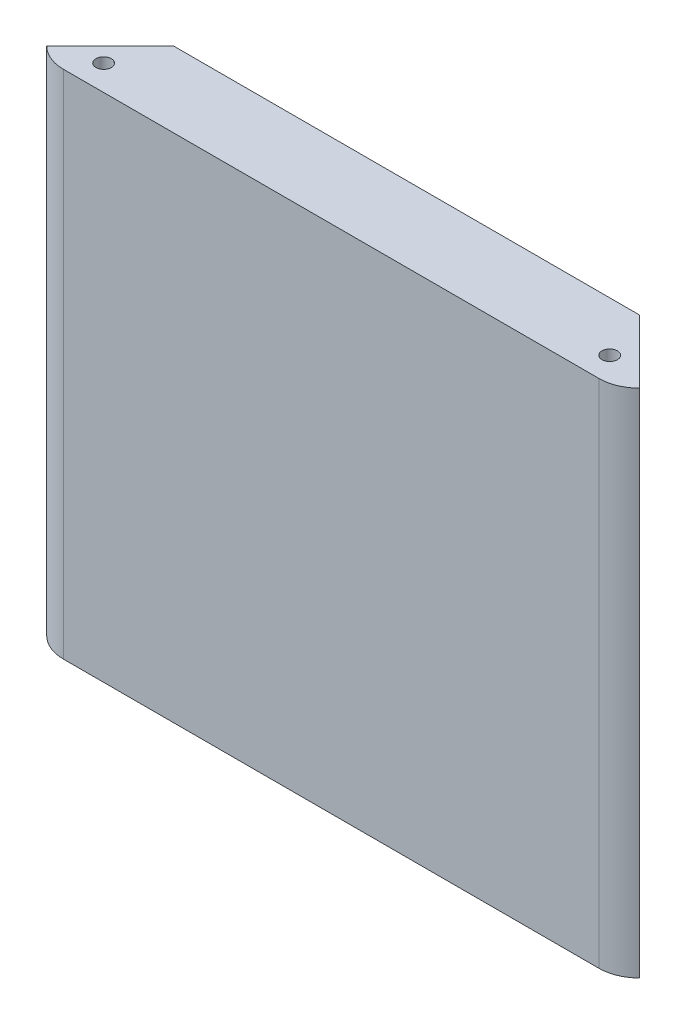
ISO-10303-21;
HEADER;
FILE_DESCRIPTION(('STEP AP214'),'2;1');
FILE_NAME('part.step','',(''),(''),'','','');
FILE_SCHEMA(('AUTOMOTIVE_DESIGN { 1 0 10303 214 1 1 1 1 }'));
ENDSEC;
DATA;
#1=APPLICATION_CONTEXT('core data for automotive mechanical design processes');
#2=APPLICATION_PROTOCOL_DEFINITION('international standard','automotive_design',2000,#1);
#3=PRODUCT_CONTEXT('',#1,'mechanical');
#4=PRODUCT('Part','Part','',(#3));
#5=PRODUCT_RELATED_PRODUCT_CATEGORY('part','',(#4));
#6=PRODUCT_DEFINITION_FORMATION('','',#4);
#7=PRODUCT_DEFINITION_CONTEXT('part definition',#1,'design');
#8=PRODUCT_DEFINITION('design','',#6,#7);
#9=PRODUCT_DEFINITION_SHAPE('','',#8);
#10=(LENGTH_UNIT() NAMED_UNIT(*) SI_UNIT(.MILLI.,.METRE.));
#11=(NAMED_UNIT(*) PLANE_ANGLE_UNIT() SI_UNIT($,.RADIAN.));
#12=(NAMED_UNIT(*) SI_UNIT($,.STERADIAN.) SOLID_ANGLE_UNIT());
#13=UNCERTAINTY_MEASURE_WITH_UNIT(LENGTH_MEASURE(1.E-05),#10,'distance_accuracy_value','');
#14=(GEOMETRIC_REPRESENTATION_CONTEXT(3) GLOBAL_UNCERTAINTY_ASSIGNED_CONTEXT((#13)) GLOBAL_UNIT_ASSIGNED_CONTEXT((#10,
#11,#12)) REPRESENTATION_CONTEXT('',''));
#15=CARTESIAN_POINT('',(0.,0.,0.));
#16=DIRECTION('',(0.,0.,1.));
#17=DIRECTION('',(1.,0.,0.));
#18=AXIS2_PLACEMENT_3D('',#15,#16,#17);
#19=CARTESIAN_POINT('',(-40.95,-33.95,-10.));
#20=DIRECTION('',(0.,-1.,0.));
#21=DIRECTION('',(0.,0.,-1.));
#22=AXIS2_PLACEMENT_3D('',#19,#20,#21);
#23=PLANE('',#22);
#24=DIRECTION('',(0.707106781186548,0.,0.707106781186548));
#25=VECTOR('',#24,1.);
#26=CARTESIAN_POINT('',(20.475,-33.95,-20.475));
#27=LINE('',#26,#25);
#28=CARTESIAN_POINT('',(30.95,-33.95,-10.));
#29=VERTEX_POINT('',#28);
#30=CARTESIAN_POINT('',(39.3830212793475,-33.95,-1.56697872065252));
#31=VERTEX_POINT('',#30);
#32=EDGE_CURVE('E133',#29,#31,#27,.T.);
#33=ORIENTED_EDGE('',*,*,#32,.T.);
#34=CARTESIAN_POINT('',(35.5999999999992,-33.95,-5.34999999999922));
#35=DIRECTION('',(0.,-1.,0.));
#36=DIRECTION('',(0.,0.,1.));
#37=AXIS2_PLACEMENT_3D('',#34,#35,#36);
#38=CIRCLE('',#37,5.34999999999921);
#39=CARTESIAN_POINT('',(35.5999999999992,-33.95,0.));
#40=VERTEX_POINT('',#39);
#41=EDGE_CURVE('E141',#31,#40,#38,.T.);
#42=ORIENTED_EDGE('',*,*,#41,.T.);
#43=DIRECTION('',(1.,0.,0.));
#44=VECTOR('',#43,1.);
#45=CARTESIAN_POINT('',(-40.95,-33.95,0.));
#46=LINE('',#45,#44);
#47=CARTESIAN_POINT('',(-35.5999999999992,-33.95,0.));
#48=VERTEX_POINT('',#47);
#49=EDGE_CURVE('E41',#48,#40,#46,.T.);
#50=ORIENTED_EDGE('',*,*,#49,.F.);
#51=CARTESIAN_POINT('',(-35.5999999999992,-33.95,-5.34999999999922));
#52=DIRECTION('',(0.,-1.,0.));
#53=DIRECTION('',(0.,0.,-1.));
#54=AXIS2_PLACEMENT_3D('',#51,#52,#53);
#55=CIRCLE('',#54,5.34999999999921);
#56=CARTESIAN_POINT('',(-39.3830212793475,-33.95,-1.56697872065252));
#57=VERTEX_POINT('',#56);
#58=EDGE_CURVE('E197',#48,#57,#55,.T.);
#59=ORIENTED_EDGE('',*,*,#58,.T.);
#60=DIRECTION('',(-0.707106781186548,0.,0.707106781186548));
#61=VECTOR('',#60,1.);
#62=CARTESIAN_POINT('',(-20.475,-33.95,-20.475));
#63=LINE('',#62,#61);
#64=CARTESIAN_POINT('',(-30.95,-33.95,-10.));
#65=VERTEX_POINT('',#64);
#66=EDGE_CURVE('E149',#65,#57,#63,.T.);
#67=ORIENTED_EDGE('',*,*,#66,.F.);
#68=DIRECTION('',(1.,0.,0.));
#69=VECTOR('',#68,1.);
#70=CARTESIAN_POINT('',(-40.95,-33.95,-10.));
#71=LINE('',#70,#69);
#72=EDGE_CURVE('E11',#65,#29,#71,.T.);
#73=ORIENTED_EDGE('',*,*,#72,.T.);
#74=EDGE_LOOP('',(#33,#42,#50,#59,#67,#73));
#75=FACE_BOUND('',#74,.T.);
#76=CARTESIAN_POINT('',(33.6321067811865,-33.95,-3.38210678118655));
#77=DIRECTION('',(0.,-1.,0.));
#78=DIRECTION('',(0.,0.,-1.));
#79=AXIS2_PLACEMENT_3D('',#76,#77,#78);
#80=CIRCLE('',#79,1.02499999999999);
#81=CARTESIAN_POINT('',(33.6321067811865,-33.95,-4.40710678118654));
#82=VERTEX_POINT('',#81);
#83=EDGE_CURVE('E220',#82,#82,#80,.T.);
#84=ORIENTED_EDGE('',*,*,#83,.F.);
#85=EDGE_LOOP('',(#84));
#86=FACE_BOUND('',#85,.T.);
#87=CARTESIAN_POINT('',(-33.6321067811865,-33.95,-3.38210678118655));
#88=DIRECTION('',(0.,-1.,0.));
#89=DIRECTION('',(0.,0.,-1.));
#90=AXIS2_PLACEMENT_3D('',#87,#88,#89);
#91=CIRCLE('',#90,1.02499999999999);
#92=CARTESIAN_POINT('',(-33.6321067811865,-33.95,-4.40710678118654));
#93=VERTEX_POINT('',#92);
#94=EDGE_CURVE('E229',#93,#93,#91,.T.);
#95=ORIENTED_EDGE('',*,*,#94,.F.);
#96=EDGE_LOOP('',(#95));
#97=FACE_BOUND('',#96,.T.);
#98=ADVANCED_FACE('F37',(#75,#86,#97),#23,.T.);
#99=CARTESIAN_POINT('',(-40.95,33.95,-10.));
#100=DIRECTION('',(0.,1.,0.));
#101=DIRECTION('',(0.,0.,1.));
#102=AXIS2_PLACEMENT_3D('',#99,#100,#101);
#103=PLANE('',#102);
#104=DIRECTION('',(0.707106781186548,0.,0.707106781186548));
#105=VECTOR('',#104,1.);
#106=CARTESIAN_POINT('',(20.475,33.95,-20.475));
#107=LINE('',#106,#105);
#108=CARTESIAN_POINT('',(30.95,33.95,-10.));
#109=VERTEX_POINT('',#108);
#110=CARTESIAN_POINT('',(39.3830212793475,33.95,-1.56697872065252));
#111=VERTEX_POINT('',#110);
#112=EDGE_CURVE('E136',#109,#111,#107,.T.);
#113=ORIENTED_EDGE('',*,*,#112,.F.);
#114=DIRECTION('',(-1.,0.,0.));
#115=VECTOR('',#114,1.);
#116=CARTESIAN_POINT('',(-40.95,33.95,-10.));
#117=LINE('',#116,#115);
#118=CARTESIAN_POINT('',(-30.95,33.95,-10.));
#119=VERTEX_POINT('',#118);
#120=EDGE_CURVE('E46',#109,#119,#117,.T.);
#121=ORIENTED_EDGE('',*,*,#120,.T.);
#122=DIRECTION('',(-0.707106781186548,0.,0.707106781186548));
#123=VECTOR('',#122,1.);
#124=CARTESIAN_POINT('',(-20.475,33.95,-20.475));
#125=LINE('',#124,#123);
#126=CARTESIAN_POINT('',(-39.3830212793475,33.95,-1.56697872065251));
#127=VERTEX_POINT('',#126);
#128=EDGE_CURVE('E213',#119,#127,#125,.T.);
#129=ORIENTED_EDGE('',*,*,#128,.T.);
#130=CARTESIAN_POINT('',(-35.5999999999992,33.95,-5.34999999999922));
#131=DIRECTION('',(0.,1.,0.));
#132=DIRECTION('',(0.,0.,1.));
#133=AXIS2_PLACEMENT_3D('',#130,#131,#132);
#134=CIRCLE('',#133,5.34999999999921);
#135=CARTESIAN_POINT('',(-35.5999999999992,33.95,0.));
#136=VERTEX_POINT('',#135);
#137=EDGE_CURVE('E200',#136,#127,#134,.F.);
#138=ORIENTED_EDGE('',*,*,#137,.F.);
#139=DIRECTION('',(-1.,0.,0.));
#140=VECTOR('',#139,1.);
#141=CARTESIAN_POINT('',(-40.95,33.95,0.));
#142=LINE('',#141,#140);
#143=CARTESIAN_POINT('',(35.5999999999992,33.95,0.));
#144=VERTEX_POINT('',#143);
#145=EDGE_CURVE('E184',#144,#136,#142,.T.);
#146=ORIENTED_EDGE('',*,*,#145,.F.);
#147=CARTESIAN_POINT('',(35.5999999999992,33.95,-5.34999999999922));
#148=DIRECTION('',(0.,1.,0.));
#149=DIRECTION('',(0.,0.,1.));
#150=AXIS2_PLACEMENT_3D('',#147,#148,#149);
#151=CIRCLE('',#150,5.34999999999921);
#152=EDGE_CURVE('E155',#111,#144,#151,.F.);
#153=ORIENTED_EDGE('',*,*,#152,.F.);
#154=EDGE_LOOP('',(#113,#121,#129,#138,#146,#153));
#155=FACE_BOUND('',#154,.T.);
#156=CARTESIAN_POINT('',(33.6321067811865,33.95,-3.38210678118655));
#157=DIRECTION('',(0.,1.,0.));
#158=DIRECTION('',(0.,0.,1.));
#159=AXIS2_PLACEMENT_3D('',#156,#157,#158);
#160=CIRCLE('',#159,1.02499999999999);
#161=CARTESIAN_POINT('',(33.6321067811865,33.95,-2.35710678118655));
#162=VERTEX_POINT('',#161);
#163=EDGE_CURVE('E235',#162,#162,#160,.T.);
#164=ORIENTED_EDGE('',*,*,#163,.F.);
#165=EDGE_LOOP('',(#164));
#166=FACE_BOUND('',#165,.T.);
#167=CARTESIAN_POINT('',(-33.6321067811865,33.95,-3.38210678118655));
#168=DIRECTION('',(0.,1.,0.));
#169=DIRECTION('',(0.,0.,1.));
#170=AXIS2_PLACEMENT_3D('',#167,#168,#169);
#171=CIRCLE('',#170,1.02499999999999);
#172=CARTESIAN_POINT('',(-33.6321067811865,33.95,-2.35710678118655));
#173=VERTEX_POINT('',#172);
#174=EDGE_CURVE('E241',#173,#173,#171,.T.);
#175=ORIENTED_EDGE('',*,*,#174,.F.);
#176=EDGE_LOOP('',(#175));
#177=FACE_BOUND('',#176,.T.);
#178=ADVANCED_FACE('F39',(#155,#166,#177),#103,.T.);
#179=CARTESIAN_POINT('',(0.,0.,-10.));
#180=DIRECTION('',(0.,0.,1.));
#181=DIRECTION('',(1.,0.,0.));
#182=AXIS2_PLACEMENT_3D('',#179,#180,#181);
#183=PLANE('',#182);
#184=DIRECTION('',(1.,0.,0.));
#185=VECTOR('',#184,1.);
#186=CARTESIAN_POINT('',(30.25,30.25,-10.));
#187=LINE('',#186,#185);
#188=CARTESIAN_POINT('',(-30.25,30.25,-10.));
#189=VERTEX_POINT('',#188);
#190=CARTESIAN_POINT('',(30.25,30.25,-10.));
#191=VERTEX_POINT('',#190);
#192=EDGE_CURVE('E176',#189,#191,#187,.T.);
#193=ORIENTED_EDGE('',*,*,#192,.F.);
#194=DIRECTION('',(0.,1.,0.));
#195=VECTOR('',#194,1.);
#196=CARTESIAN_POINT('',(-30.25,30.25,-10.));
#197=LINE('',#196,#195);
#198=CARTESIAN_POINT('',(-30.25,-30.25,-10.));
#199=VERTEX_POINT('',#198);
#200=EDGE_CURVE('E54',#199,#189,#197,.T.);
#201=ORIENTED_EDGE('',*,*,#200,.F.);
#202=DIRECTION('',(-1.,0.,0.));
#203=VECTOR('',#202,1.);
#204=CARTESIAN_POINT('',(30.25,-30.25,-10.));
#205=LINE('',#204,#203);
#206=CARTESIAN_POINT('',(30.25,-30.25,-10.));
#207=VERTEX_POINT('',#206);
#208=EDGE_CURVE('E166',#207,#199,#205,.T.);
#209=ORIENTED_EDGE('',*,*,#208,.F.);
#210=DIRECTION('',(0.,-1.,0.));
#211=VECTOR('',#210,1.);
#212=CARTESIAN_POINT('',(30.25,30.25,-10.));
#213=LINE('',#212,#211);
#214=EDGE_CURVE('E179',#191,#207,#213,.T.);
#215=ORIENTED_EDGE('',*,*,#214,.F.);
#216=EDGE_LOOP('',(#193,#201,#209,#215));
#217=FACE_BOUND('',#216,.T.);
#218=ORIENTED_EDGE('',*,*,#120,.F.);
#219=DIRECTION('',(0.,1.,0.));
#220=VECTOR('',#219,1.);
#221=CARTESIAN_POINT('',(30.95,-33.951,-10.));
#222=LINE('',#221,#220);
#223=EDGE_CURVE('E150',#29,#109,#222,.T.);
#224=ORIENTED_EDGE('',*,*,#223,.F.);
#225=ORIENTED_EDGE('',*,*,#72,.F.);
#226=DIRECTION('',(0.,1.,0.));
#227=VECTOR('',#226,1.);
#228=CARTESIAN_POINT('',(-30.95,-33.951,-10.));
#229=LINE('',#228,#227);
#230=EDGE_CURVE('E218',#65,#119,#229,.T.);
#231=ORIENTED_EDGE('',*,*,#230,.T.);
#232=EDGE_LOOP('',(#218,#224,#225,#231));
#233=FACE_BOUND('',#232,.T.);
#234=ADVANCED_FACE('F256',(#217,#233),#183,.F.);
#235=CARTESIAN_POINT('',(0.,0.,0.));
#236=DIRECTION('',(0.,0.,1.));
#237=DIRECTION('',(1.,0.,0.));
#238=AXIS2_PLACEMENT_3D('',#235,#236,#237);
#239=PLANE('',#238);
#240=ORIENTED_EDGE('',*,*,#145,.T.);
#241=DIRECTION('',(0.,-1.,0.));
#242=VECTOR('',#241,1.);
#243=CARTESIAN_POINT('',(-35.5999999999992,33.951,0.));
#244=LINE('',#243,#242);
#245=EDGE_CURVE('E195',#136,#48,#244,.T.);
#246=ORIENTED_EDGE('',*,*,#245,.T.);
#247=ORIENTED_EDGE('',*,*,#49,.T.);
#248=DIRECTION('',(0.,-1.,0.));
#249=VECTOR('',#248,1.);
#250=CARTESIAN_POINT('',(35.5999999999992,33.951,0.));
#251=LINE('',#250,#249);
#252=EDGE_CURVE('E140',#144,#40,#251,.T.);
#253=ORIENTED_EDGE('',*,*,#252,.F.);
#254=EDGE_LOOP('',(#240,#246,#247,#253));
#255=FACE_BOUND('',#254,.T.);
#256=ADVANCED_FACE('F194',(#255),#239,.T.);
#257=CARTESIAN_POINT('',(-30.25,30.25,-1.5));
#258=DIRECTION('',(-1.,0.,0.));
#259=DIRECTION('',(0.,-1.,0.));
#260=AXIS2_PLACEMENT_3D('',#257,#258,#259);
#261=PLANE('',#260);
#262=ORIENTED_EDGE('',*,*,#200,.T.);
#263=DIRECTION('',(0.,0.,-1.));
#264=VECTOR('',#263,1.);
#265=CARTESIAN_POINT('',(-30.25,30.25,-1.5));
#266=LINE('',#265,#264);
#267=CARTESIAN_POINT('',(-30.25,30.25,-1.5));
#268=VERTEX_POINT('',#267);
#269=EDGE_CURVE('E78',#268,#189,#266,.T.);
#270=ORIENTED_EDGE('',*,*,#269,.F.);
#271=DIRECTION('',(0.,1.,0.));
#272=VECTOR('',#271,1.);
#273=CARTESIAN_POINT('',(-30.25,30.25,-1.5));
#274=LINE('',#273,#272);
#275=CARTESIAN_POINT('',(-30.25,-30.25,-1.5));
#276=VERTEX_POINT('',#275);
#277=EDGE_CURVE('E162',#276,#268,#274,.T.);
#278=ORIENTED_EDGE('',*,*,#277,.F.);
#279=DIRECTION('',(0.,0.,-1.));
#280=VECTOR('',#279,1.);
#281=CARTESIAN_POINT('',(-30.25,-30.25,-1.5));
#282=LINE('',#281,#280);
#283=EDGE_CURVE('E62',#276,#199,#282,.T.);
#284=ORIENTED_EDGE('',*,*,#283,.T.);
#285=EDGE_LOOP('',(#262,#270,#278,#284));
#286=FACE_BOUND('',#285,.T.);
#287=ADVANCED_FACE('F267',(#286),#261,.F.);
#288=CARTESIAN_POINT('',(30.25,-30.25,-1.5));
#289=DIRECTION('',(0.,-1.,0.));
#290=DIRECTION('',(0.,0.,-1.));
#291=AXIS2_PLACEMENT_3D('',#288,#289,#290);
#292=PLANE('',#291);
#293=ORIENTED_EDGE('',*,*,#208,.T.);
#294=ORIENTED_EDGE('',*,*,#283,.F.);
#295=DIRECTION('',(-1.,0.,0.));
#296=VECTOR('',#295,1.);
#297=CARTESIAN_POINT('',(30.25,-30.25,-1.5));
#298=LINE('',#297,#296);
#299=CARTESIAN_POINT('',(30.25,-30.25,-1.5));
#300=VERTEX_POINT('',#299);
#301=EDGE_CURVE('E172',#300,#276,#298,.T.);
#302=ORIENTED_EDGE('',*,*,#301,.F.);
#303=DIRECTION('',(0.,0.,-1.));
#304=VECTOR('',#303,1.);
#305=CARTESIAN_POINT('',(30.25,-30.25,-1.5));
#306=LINE('',#305,#304);
#307=EDGE_CURVE('E185',#300,#207,#306,.T.);
#308=ORIENTED_EDGE('',*,*,#307,.T.);
#309=EDGE_LOOP('',(#293,#294,#302,#308));
#310=FACE_BOUND('',#309,.T.);
#311=ADVANCED_FACE('F271',(#310),#292,.F.);
#312=CARTESIAN_POINT('',(30.25,30.25,-1.5));
#313=DIRECTION('',(1.,0.,0.));
#314=DIRECTION('',(0.,1.,0.));
#315=AXIS2_PLACEMENT_3D('',#312,#313,#314);
#316=PLANE('',#315);
#317=ORIENTED_EDGE('',*,*,#214,.T.);
#318=ORIENTED_EDGE('',*,*,#307,.F.);
#319=DIRECTION('',(0.,-1.,0.));
#320=VECTOR('',#319,1.);
#321=CARTESIAN_POINT('',(30.25,30.25,-1.5));
#322=LINE('',#321,#320);
#323=CARTESIAN_POINT('',(30.25,30.25,-1.5));
#324=VERTEX_POINT('',#323);
#325=EDGE_CURVE('E169',#324,#300,#322,.T.);
#326=ORIENTED_EDGE('',*,*,#325,.F.);
#327=DIRECTION('',(0.,0.,-1.));
#328=VECTOR('',#327,1.);
#329=CARTESIAN_POINT('',(30.25,30.25,-1.5));
#330=LINE('',#329,#328);
#331=EDGE_CURVE('E187',#324,#191,#330,.T.);
#332=ORIENTED_EDGE('',*,*,#331,.T.);
#333=EDGE_LOOP('',(#317,#318,#326,#332));
#334=FACE_BOUND('',#333,.T.);
#335=ADVANCED_FACE('F276',(#334),#316,.F.);
#336=CARTESIAN_POINT('',(30.25,30.25,-1.5));
#337=DIRECTION('',(0.,1.,0.));
#338=DIRECTION('',(0.,0.,1.));
#339=AXIS2_PLACEMENT_3D('',#336,#337,#338);
#340=PLANE('',#339);
#341=ORIENTED_EDGE('',*,*,#192,.T.);
#342=ORIENTED_EDGE('',*,*,#331,.F.);
#343=DIRECTION('',(1.,0.,0.));
#344=VECTOR('',#343,1.);
#345=CARTESIAN_POINT('',(30.25,30.25,-1.5));
#346=LINE('',#345,#344);
#347=EDGE_CURVE('E165',#268,#324,#346,.T.);
#348=ORIENTED_EDGE('',*,*,#347,.F.);
#349=ORIENTED_EDGE('',*,*,#269,.T.);
#350=EDGE_LOOP('',(#341,#342,#348,#349));
#351=FACE_BOUND('',#350,.T.);
#352=ADVANCED_FACE('F272',(#351),#340,.F.);
#353=CARTESIAN_POINT('',(0.,0.,-1.5));
#354=DIRECTION('',(0.,0.,-1.));
#355=DIRECTION('',(-1.,0.,0.));
#356=AXIS2_PLACEMENT_3D('',#353,#354,#355);
#357=PLANE('',#356);
#358=ORIENTED_EDGE('',*,*,#277,.T.);
#359=ORIENTED_EDGE('',*,*,#347,.T.);
#360=ORIENTED_EDGE('',*,*,#325,.T.);
#361=ORIENTED_EDGE('',*,*,#301,.T.);
#362=EDGE_LOOP('',(#358,#359,#360,#361));
#363=FACE_BOUND('',#362,.T.);
#364=ADVANCED_FACE('F275',(#363),#357,.T.);
#365=CARTESIAN_POINT('',(35.5999999999992,33.951,-5.34999999999922));
#366=DIRECTION('',(0.,-1.,0.));
#367=DIRECTION('',(0.,0.,-1.));
#368=AXIS2_PLACEMENT_3D('',#365,#366,#367);
#369=CYLINDRICAL_SURFACE('',#368,5.34999999999921);
#370=ORIENTED_EDGE('',*,*,#152,.T.);
#371=ORIENTED_EDGE('',*,*,#252,.T.);
#372=ORIENTED_EDGE('',*,*,#41,.F.);
#373=DIRECTION('',(0.,-1.,0.));
#374=VECTOR('',#373,1.);
#375=CARTESIAN_POINT('',(39.3830212793475,33.951,-1.56697872065252));
#376=LINE('',#375,#374);
#377=EDGE_CURVE('E130',#111,#31,#376,.T.);
#378=ORIENTED_EDGE('',*,*,#377,.F.);
#379=EDGE_LOOP('',(#370,#371,#372,#378));
#380=FACE_BOUND('',#379,.T.);
#381=ADVANCED_FACE('F153',(#380),#369,.T.);
#382=CARTESIAN_POINT('',(-35.5999999999992,33.951,-5.34999999999922));
#383=DIRECTION('',(0.,-1.,0.));
#384=DIRECTION('',(0.,0.,-1.));
#385=AXIS2_PLACEMENT_3D('',#382,#383,#384);
#386=CYLINDRICAL_SURFACE('',#385,5.34999999999921);
#387=ORIENTED_EDGE('',*,*,#137,.T.);
#388=DIRECTION('',(0.,-1.,0.));
#389=VECTOR('',#388,1.);
#390=CARTESIAN_POINT('',(-39.3830212793475,33.951,-1.56697872065252));
#391=LINE('',#390,#389);
#392=EDGE_CURVE('E157',#127,#57,#391,.T.);
#393=ORIENTED_EDGE('',*,*,#392,.T.);
#394=ORIENTED_EDGE('',*,*,#58,.F.);
#395=ORIENTED_EDGE('',*,*,#245,.F.);
#396=EDGE_LOOP('',(#387,#393,#394,#395));
#397=FACE_BOUND('',#396,.T.);
#398=ADVANCED_FACE('F207',(#397),#386,.T.);
#399=CARTESIAN_POINT('',(-33.6321067811865,28.95,-3.38210678118655));
#400=DIRECTION('',(0.,1.,0.));
#401=DIRECTION('',(0.,0.,1.));
#402=AXIS2_PLACEMENT_3D('',#399,#400,#401);
#403=CONICAL_SURFACE('',#402,1.025,1.02974425867665);
#404=CARTESIAN_POINT('',(-33.6321067811865,28.3341178654968,-3.38210678118655));
#405=VERTEX_POINT('',#404);
#406=VERTEX_LOOP('',#405);
#407=FACE_BOUND('',#406,.T.);
#408=CARTESIAN_POINT('',(-33.6321067811865,28.95,-3.38210678118655));
#409=DIRECTION('',(0.,1.,0.));
#410=DIRECTION('',(0.,0.,1.));
#411=AXIS2_PLACEMENT_3D('',#408,#409,#410);
#412=CIRCLE('',#411,1.025);
#413=CARTESIAN_POINT('',(-33.6321067811865,28.95,-2.35710678118655));
#414=VERTEX_POINT('',#413);
#415=EDGE_CURVE('E204',#414,#414,#412,.T.);
#416=ORIENTED_EDGE('',*,*,#415,.T.);
#417=EDGE_LOOP('',(#416));
#418=FACE_BOUND('',#417,.T.);
#419=ADVANCED_FACE('F246',(#407,#418),#403,.F.);
#420=CARTESIAN_POINT('',(-33.6321067811865,33.95,-3.38210678118655));
#421=DIRECTION('',(0.,1.,0.));
#422=DIRECTION('',(0.,0.,1.));
#423=AXIS2_PLACEMENT_3D('',#420,#421,#422);
#424=CYLINDRICAL_SURFACE('',#423,1.02499999999999);
#425=ORIENTED_EDGE('',*,*,#415,.F.);
#426=EDGE_LOOP('',(#425));
#427=FACE_BOUND('',#426,.T.);
#428=ORIENTED_EDGE('',*,*,#174,.T.);
#429=EDGE_LOOP('',(#428));
#430=FACE_BOUND('',#429,.T.);
#431=ADVANCED_FACE('F248',(#427,#430),#424,.F.);
#432=CARTESIAN_POINT('',(33.6321067811865,28.95,-3.38210678118655));
#433=DIRECTION('',(0.,1.,0.));
#434=DIRECTION('',(0.,0.,1.));
#435=AXIS2_PLACEMENT_3D('',#432,#433,#434);
#436=CONICAL_SURFACE('',#435,1.025,1.02974425867665);
#437=CARTESIAN_POINT('',(33.6321067811865,28.3341178654968,-3.38210678118655));
#438=VERTEX_POINT('',#437);
#439=VERTEX_LOOP('',#438);
#440=FACE_BOUND('',#439,.T.);
#441=CARTESIAN_POINT('',(33.6321067811865,28.95,-3.38210678118655));
#442=DIRECTION('',(0.,1.,0.));
#443=DIRECTION('',(0.,0.,1.));
#444=AXIS2_PLACEMENT_3D('',#441,#442,#443);
#445=CIRCLE('',#444,1.025);
#446=CARTESIAN_POINT('',(33.6321067811865,28.95,-2.35710678118655));
#447=VERTEX_POINT('',#446);
#448=EDGE_CURVE('E238',#447,#447,#445,.T.);
#449=ORIENTED_EDGE('',*,*,#448,.T.);
#450=EDGE_LOOP('',(#449));
#451=FACE_BOUND('',#450,.T.);
#452=ADVANCED_FACE('F251',(#440,#451),#436,.F.);
#453=CARTESIAN_POINT('',(33.6321067811865,33.95,-3.38210678118655));
#454=DIRECTION('',(0.,1.,0.));
#455=DIRECTION('',(0.,0.,1.));
#456=AXIS2_PLACEMENT_3D('',#453,#454,#455);
#457=CYLINDRICAL_SURFACE('',#456,1.02499999999999);
#458=ORIENTED_EDGE('',*,*,#448,.F.);
#459=EDGE_LOOP('',(#458));
#460=FACE_BOUND('',#459,.T.);
#461=ORIENTED_EDGE('',*,*,#163,.T.);
#462=EDGE_LOOP('',(#461));
#463=FACE_BOUND('',#462,.T.);
#464=ADVANCED_FACE('F295',(#460,#463),#457,.F.);
#465=CARTESIAN_POINT('',(-33.6321067811865,-28.95,-3.38210678118655));
#466=DIRECTION('',(0.,-1.,0.));
#467=DIRECTION('',(0.,0.,-1.));
#468=AXIS2_PLACEMENT_3D('',#465,#466,#467);
#469=CONICAL_SURFACE('',#468,1.025,1.02974425867665);
#470=CARTESIAN_POINT('',(-33.6321067811865,-28.3341178654968,-3.38210678118655));
#471=VERTEX_POINT('',#470);
#472=VERTEX_LOOP('',#471);
#473=FACE_BOUND('',#472,.T.);
#474=CARTESIAN_POINT('',(-33.6321067811865,-28.95,-3.38210678118655));
#475=DIRECTION('',(0.,-1.,0.));
#476=DIRECTION('',(0.,0.,-1.));
#477=AXIS2_PLACEMENT_3D('',#474,#475,#476);
#478=CIRCLE('',#477,1.025);
#479=CARTESIAN_POINT('',(-33.6321067811865,-28.95,-4.40710678118654));
#480=VERTEX_POINT('',#479);
#481=EDGE_CURVE('E232',#480,#480,#478,.T.);
#482=ORIENTED_EDGE('',*,*,#481,.T.);
#483=EDGE_LOOP('',(#482));
#484=FACE_BOUND('',#483,.T.);
#485=ADVANCED_FACE('F299',(#473,#484),#469,.F.);
#486=CARTESIAN_POINT('',(-33.6321067811865,-33.95,-3.38210678118655));
#487=DIRECTION('',(0.,-1.,0.));
#488=DIRECTION('',(0.,0.,-1.));
#489=AXIS2_PLACEMENT_3D('',#486,#487,#488);
#490=CYLINDRICAL_SURFACE('',#489,1.02499999999999);
#491=ORIENTED_EDGE('',*,*,#481,.F.);
#492=EDGE_LOOP('',(#491));
#493=FACE_BOUND('',#492,.T.);
#494=ORIENTED_EDGE('',*,*,#94,.T.);
#495=EDGE_LOOP('',(#494));
#496=FACE_BOUND('',#495,.T.);
#497=ADVANCED_FACE('F303',(#493,#496),#490,.F.);
#498=CARTESIAN_POINT('',(33.6321067811865,-28.95,-3.38210678118655));
#499=DIRECTION('',(0.,-1.,0.));
#500=DIRECTION('',(0.,0.,-1.));
#501=AXIS2_PLACEMENT_3D('',#498,#499,#500);
#502=CONICAL_SURFACE('',#501,1.025,1.02974425867665);
#503=CARTESIAN_POINT('',(33.6321067811865,-28.3341178654968,-3.38210678118655));
#504=VERTEX_POINT('',#503);
#505=VERTEX_LOOP('',#504);
#506=FACE_BOUND('',#505,.T.);
#507=CARTESIAN_POINT('',(33.6321067811865,-28.95,-3.38210678118655));
#508=DIRECTION('',(0.,-1.,0.));
#509=DIRECTION('',(0.,0.,-1.));
#510=AXIS2_PLACEMENT_3D('',#507,#508,#509);
#511=CIRCLE('',#510,1.025);
#512=CARTESIAN_POINT('',(33.6321067811865,-28.95,-4.40710678118654));
#513=VERTEX_POINT('',#512);
#514=EDGE_CURVE('E226',#513,#513,#511,.T.);
#515=ORIENTED_EDGE('',*,*,#514,.T.);
#516=EDGE_LOOP('',(#515));
#517=FACE_BOUND('',#516,.T.);
#518=ADVANCED_FACE('F307',(#506,#517),#502,.F.);
#519=CARTESIAN_POINT('',(33.6321067811865,-33.95,-3.38210678118655));
#520=DIRECTION('',(0.,-1.,0.));
#521=DIRECTION('',(0.,0.,-1.));
#522=AXIS2_PLACEMENT_3D('',#519,#520,#521);
#523=CYLINDRICAL_SURFACE('',#522,1.02499999999999);
#524=ORIENTED_EDGE('',*,*,#514,.F.);
#525=EDGE_LOOP('',(#524));
#526=FACE_BOUND('',#525,.T.);
#527=ORIENTED_EDGE('',*,*,#83,.T.);
#528=EDGE_LOOP('',(#527));
#529=FACE_BOUND('',#528,.T.);
#530=ADVANCED_FACE('F311',(#526,#529),#523,.F.);
#531=CARTESIAN_POINT('',(-20.475,-33.951,-20.475));
#532=DIRECTION('',(-0.707106781186548,0.,-0.707106781186548));
#533=DIRECTION('',(-0.707106781186548,0.,0.707106781186548));
#534=AXIS2_PLACEMENT_3D('',#531,#532,#533);
#535=PLANE('',#534);
#536=ORIENTED_EDGE('',*,*,#66,.T.);
#537=ORIENTED_EDGE('',*,*,#392,.F.);
#538=ORIENTED_EDGE('',*,*,#128,.F.);
#539=ORIENTED_EDGE('',*,*,#230,.F.);
#540=EDGE_LOOP('',(#536,#537,#538,#539));
#541=FACE_BOUND('',#540,.T.);
#542=ADVANCED_FACE('F212',(#541),#535,.T.);
#543=CARTESIAN_POINT('',(20.475,-33.951,-20.475));
#544=DIRECTION('',(-0.707106781186548,0.,0.707106781186548));
#545=DIRECTION('',(0.707106781186548,0.,0.707106781186548));
#546=AXIS2_PLACEMENT_3D('',#543,#544,#545);
#547=PLANE('',#546);
#548=ORIENTED_EDGE('',*,*,#223,.T.);
#549=ORIENTED_EDGE('',*,*,#112,.T.);
#550=ORIENTED_EDGE('',*,*,#377,.T.);
#551=ORIENTED_EDGE('',*,*,#32,.F.);
#552=EDGE_LOOP('',(#548,#549,#550,#551));
#553=FACE_BOUND('',#552,.T.);
#554=ADVANCED_FACE('F132',(#553),#547,.F.);
#555=CLOSED_SHELL('',(#98,#178,#234,#256,#287,#311,#335,#352,#364,#381,#398,#419,#431,#452,#464,
#485,#497,#518,#530,#542,#554));
#556=MANIFOLD_SOLID_BREP('B2',#555);
#557=ADVANCED_BREP_SHAPE_REPRESENTATION('',(#18,#556),#14);
#558=SHAPE_DEFINITION_REPRESENTATION(#9,#557);
ENDSEC;
END-ISO-10303-21;
